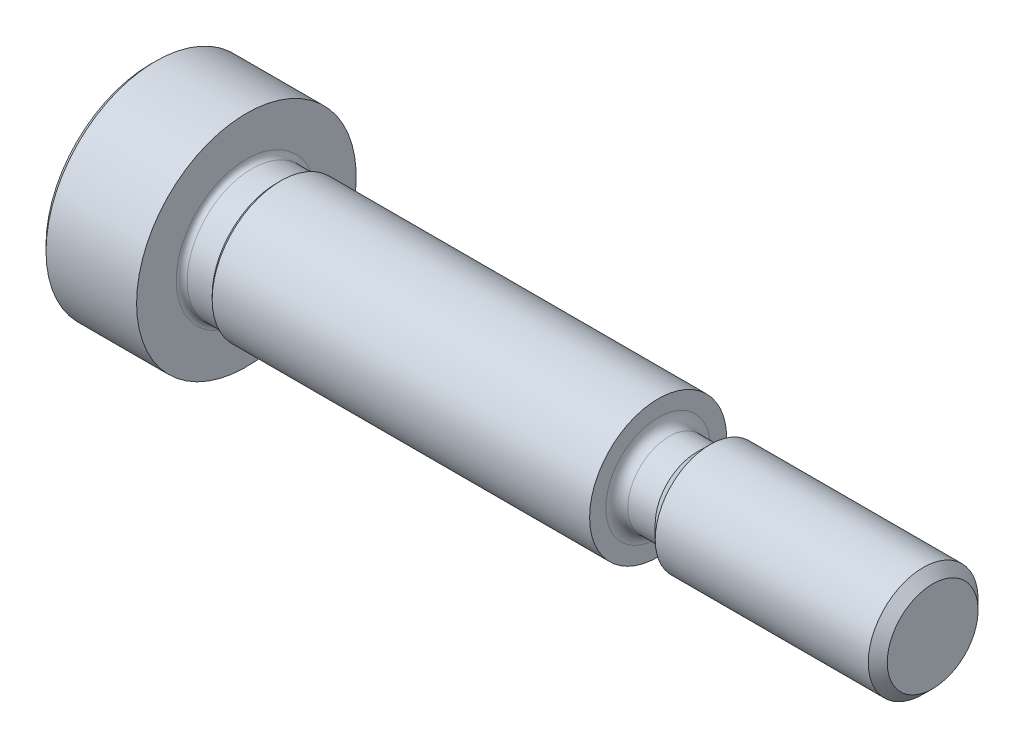
ISO-10303-21;
HEADER;
FILE_DESCRIPTION(('STEP AP214'),'2;1');
FILE_NAME('part.step','',(''),(''),'','','');
FILE_SCHEMA(('AUTOMOTIVE_DESIGN { 1 0 10303 214 1 1 1 1 }'));
ENDSEC;
DATA;
#1=APPLICATION_CONTEXT('core data for automotive mechanical design processes');
#2=APPLICATION_PROTOCOL_DEFINITION('international standard','automotive_design',2000,#1);
#3=PRODUCT_CONTEXT('',#1,'mechanical');
#4=PRODUCT('Part','Part','',(#3));
#5=PRODUCT_RELATED_PRODUCT_CATEGORY('part','',(#4));
#6=PRODUCT_DEFINITION_FORMATION('','',#4);
#7=PRODUCT_DEFINITION_CONTEXT('part definition',#1,'design');
#8=PRODUCT_DEFINITION('design','',#6,#7);
#9=PRODUCT_DEFINITION_SHAPE('','',#8);
#10=(LENGTH_UNIT() NAMED_UNIT(*) SI_UNIT(.MILLI.,.METRE.));
#11=(NAMED_UNIT(*) PLANE_ANGLE_UNIT() SI_UNIT($,.RADIAN.));
#12=(NAMED_UNIT(*) SI_UNIT($,.STERADIAN.) SOLID_ANGLE_UNIT());
#13=UNCERTAINTY_MEASURE_WITH_UNIT(LENGTH_MEASURE(1.E-05),#10,'distance_accuracy_value','');
#14=(GEOMETRIC_REPRESENTATION_CONTEXT(3) GLOBAL_UNCERTAINTY_ASSIGNED_CONTEXT((#13)) GLOBAL_UNIT_ASSIGNED_CONTEXT((#10,
#11,#12)) REPRESENTATION_CONTEXT('',''));
#15=CARTESIAN_POINT('',(0.,0.,0.));
#16=DIRECTION('',(0.,0.,1.));
#17=DIRECTION('',(1.,0.,0.));
#18=AXIS2_PLACEMENT_3D('',#15,#16,#17);
#19=CARTESIAN_POINT('',(0.,0.,0.));
#20=DIRECTION('',(-1.,0.,0.));
#21=DIRECTION('',(0.,0.,1.));
#22=AXIS2_PLACEMENT_3D('',#19,#20,#21);
#23=PLANE('',#22);
#24=CARTESIAN_POINT('',(0.,0.,0.));
#25=DIRECTION('',(-1.,0.,0.));
#26=DIRECTION('',(0.,0.,1.));
#27=AXIS2_PLACEMENT_3D('',#24,#25,#26);
#28=CIRCLE('',#27,7.6);
#29=CARTESIAN_POINT('',(0.,0.,7.6));
#30=VERTEX_POINT('',#29);
#31=EDGE_CURVE('E51',#30,#30,#28,.T.);
#32=ORIENTED_EDGE('',*,*,#31,.T.);
#33=EDGE_LOOP('',(#32));
#34=FACE_BOUND('',#33,.T.);
#35=DIRECTION('',(0.,-0.500000000000001,-0.866025403784438));
#36=VECTOR('',#35,1.);
#37=CARTESIAN_POINT('',(0.,-1.47079981076057,2.5475));
#38=LINE('',#37,#36);
#39=CARTESIAN_POINT('',(0.,-1.47079981076057,2.5475));
#40=VERTEX_POINT('',#39);
#41=CARTESIAN_POINT('',(0.,-2.94159962152114,0.));
#42=VERTEX_POINT('',#41);
#43=EDGE_CURVE('E58',#40,#42,#38,.T.);
#44=ORIENTED_EDGE('',*,*,#43,.T.);
#45=DIRECTION('',(0.,0.500000000000001,-0.866025403784438));
#46=VECTOR('',#45,1.);
#47=CARTESIAN_POINT('',(0.,-2.94159962152114,0.));
#48=LINE('',#47,#46);
#49=CARTESIAN_POINT('',(0.,-1.47079981076057,-2.5475));
#50=VERTEX_POINT('',#49);
#51=EDGE_CURVE('E313',#42,#50,#48,.T.);
#52=ORIENTED_EDGE('',*,*,#51,.T.);
#53=DIRECTION('',(0.,1.,0.));
#54=VECTOR('',#53,1.);
#55=CARTESIAN_POINT('',(0.,-1.47079981076057,-2.5475));
#56=LINE('',#55,#54);
#57=CARTESIAN_POINT('',(0.,1.47079981076057,-2.5475));
#58=VERTEX_POINT('',#57);
#59=EDGE_CURVE('E143',#50,#58,#56,.T.);
#60=ORIENTED_EDGE('',*,*,#59,.T.);
#61=DIRECTION('',(0.,0.500000000000001,0.866025403784438));
#62=VECTOR('',#61,1.);
#63=CARTESIAN_POINT('',(0.,1.47079981076057,-2.5475));
#64=LINE('',#63,#62);
#65=CARTESIAN_POINT('',(0.,2.94159962152114,0.));
#66=VERTEX_POINT('',#65);
#67=EDGE_CURVE('E316',#58,#66,#64,.T.);
#68=ORIENTED_EDGE('',*,*,#67,.T.);
#69=DIRECTION('',(0.,-0.5,0.866025403784438));
#70=VECTOR('',#69,1.);
#71=CARTESIAN_POINT('',(0.,2.94159962152114,0.));
#72=LINE('',#71,#70);
#73=CARTESIAN_POINT('',(0.,1.47079981076057,2.5475));
#74=VERTEX_POINT('',#73);
#75=EDGE_CURVE('E318',#66,#74,#72,.T.);
#76=ORIENTED_EDGE('',*,*,#75,.T.);
#77=DIRECTION('',(0.,-1.,0.));
#78=VECTOR('',#77,1.);
#79=CARTESIAN_POINT('',(0.,1.47079981076057,2.5475));
#80=LINE('',#79,#78);
#81=EDGE_CURVE('E320',#74,#40,#80,.T.);
#82=ORIENTED_EDGE('',*,*,#81,.T.);
#83=EDGE_LOOP('',(#44,#52,#60,#68,#76,#82));
#84=FACE_BOUND('',#83,.T.);
#85=ADVANCED_FACE('F43',(#34,#84),#23,.T.);
#86=CARTESIAN_POINT('',(-6.34999999999999,0.,0.));
#87=DIRECTION('',(-1.,0.,0.));
#88=DIRECTION('',(0.,0.,1.));
#89=AXIS2_PLACEMENT_3D('',#86,#87,#88);
#90=CYLINDRICAL_SURFACE('',#89,8.);
#91=CARTESIAN_POINT('',(0.4,0.,0.));
#92=DIRECTION('',(-1.,0.,0.));
#93=DIRECTION('',(0.,0.,1.));
#94=AXIS2_PLACEMENT_3D('',#91,#92,#93);
#95=CIRCLE('',#94,8.);
#96=CARTESIAN_POINT('',(0.4,0.,8.));
#97=VERTEX_POINT('',#96);
#98=EDGE_CURVE('E11',#97,#97,#95,.F.);
#99=ORIENTED_EDGE('',*,*,#98,.T.);
#100=EDGE_LOOP('',(#99));
#101=FACE_BOUND('',#100,.T.);
#102=CARTESIAN_POINT('',(7.,0.,0.));
#103=DIRECTION('',(-1.,0.,0.));
#104=DIRECTION('',(0.,0.,1.));
#105=AXIS2_PLACEMENT_3D('',#102,#103,#104);
#106=CIRCLE('',#105,8.);
#107=CARTESIAN_POINT('',(7.,0.,8.));
#108=VERTEX_POINT('',#107);
#109=EDGE_CURVE('E190',#108,#108,#106,.T.);
#110=ORIENTED_EDGE('',*,*,#109,.T.);
#111=EDGE_LOOP('',(#110));
#112=FACE_BOUND('',#111,.T.);
#113=ADVANCED_FACE('F210',(#101,#112),#90,.T.);
#114=CARTESIAN_POINT('',(7.,8.,0.));
#115=DIRECTION('',(1.,0.,0.));
#116=DIRECTION('',(0.,0.,-1.));
#117=AXIS2_PLACEMENT_3D('',#114,#115,#116);
#118=PLANE('',#117);
#119=CARTESIAN_POINT('',(7.,0.,0.));
#120=DIRECTION('',(-1.,0.,0.));
#121=DIRECTION('',(0.,0.,1.));
#122=AXIS2_PLACEMENT_3D('',#119,#120,#121);
#123=CIRCLE('',#122,5.11);
#124=CARTESIAN_POINT('',(7.,0.,5.11));
#125=VERTEX_POINT('',#124);
#126=EDGE_CURVE('E187',#125,#125,#123,.T.);
#127=ORIENTED_EDGE('',*,*,#126,.T.);
#128=EDGE_LOOP('',(#127));
#129=FACE_BOUND('',#128,.T.);
#130=ORIENTED_EDGE('',*,*,#109,.F.);
#131=EDGE_LOOP('',(#130));
#132=FACE_BOUND('',#131,.T.);
#133=ADVANCED_FACE('F213',(#129,#132),#118,.T.);
#134=CARTESIAN_POINT('',(7.4,0.,0.));
#135=DIRECTION('',(-1.,0.,0.));
#136=DIRECTION('',(0.,0.,1.));
#137=AXIS2_PLACEMENT_3D('',#134,#135,#136);
#138=TOROIDAL_SURFACE('',#137,5.11,0.4);
#139=ORIENTED_EDGE('',*,*,#126,.F.);
#140=EDGE_LOOP('',(#139));
#141=FACE_BOUND('',#140,.T.);
#142=CARTESIAN_POINT('',(7.4,0.,0.));
#143=DIRECTION('',(-1.,0.,0.));
#144=DIRECTION('',(0.,0.,1.));
#145=AXIS2_PLACEMENT_3D('',#142,#143,#144);
#146=CIRCLE('',#145,4.71);
#147=CARTESIAN_POINT('',(7.4,0.,4.71));
#148=VERTEX_POINT('',#147);
#149=EDGE_CURVE('E184',#148,#148,#146,.T.);
#150=ORIENTED_EDGE('',*,*,#149,.T.);
#151=EDGE_LOOP('',(#150));
#152=FACE_BOUND('',#151,.T.);
#153=ADVANCED_FACE('F219',(#141,#152),#138,.F.);
#154=CARTESIAN_POINT('',(-6.34999999999999,0.,0.));
#155=DIRECTION('',(-1.,0.,0.));
#156=DIRECTION('',(0.,0.,1.));
#157=AXIS2_PLACEMENT_3D('',#154,#155,#156);
#158=CYLINDRICAL_SURFACE('',#157,4.71);
#159=CARTESIAN_POINT('',(9.2165,0.,0.));
#160=DIRECTION('',(-1.,0.,0.));
#161=DIRECTION('',(0.,0.,1.));
#162=AXIS2_PLACEMENT_3D('',#159,#160,#161);
#163=CIRCLE('',#162,4.71);
#164=CARTESIAN_POINT('',(9.2165,0.,4.71));
#165=VERTEX_POINT('',#164);
#166=EDGE_CURVE('E181',#165,#165,#163,.T.);
#167=ORIENTED_EDGE('',*,*,#166,.T.);
#168=EDGE_LOOP('',(#167));
#169=FACE_BOUND('',#168,.T.);
#170=ORIENTED_EDGE('',*,*,#149,.F.);
#171=EDGE_LOOP('',(#170));
#172=FACE_BOUND('',#171,.T.);
#173=ADVANCED_FACE('F223',(#169,#172),#158,.T.);
#174=CARTESIAN_POINT('',(9.2165,0.,0.));
#175=DIRECTION('',(1.,0.,0.));
#176=DIRECTION('',(0.,0.,-1.));
#177=AXIS2_PLACEMENT_3D('',#174,#175,#176);
#178=CONICAL_SURFACE('',#177,4.71,0.785398163397453);
#179=CARTESIAN_POINT('',(9.5,0.,0.));
#180=DIRECTION('',(-1.,0.,0.));
#181=DIRECTION('',(0.,0.,1.));
#182=AXIS2_PLACEMENT_3D('',#179,#180,#181);
#183=CIRCLE('',#182,4.9935);
#184=CARTESIAN_POINT('',(9.5,0.,4.9935));
#185=VERTEX_POINT('',#184);
#186=EDGE_CURVE('E178',#185,#185,#183,.T.);
#187=ORIENTED_EDGE('',*,*,#186,.T.);
#188=EDGE_LOOP('',(#187));
#189=FACE_BOUND('',#188,.T.);
#190=ORIENTED_EDGE('',*,*,#166,.F.);
#191=EDGE_LOOP('',(#190));
#192=FACE_BOUND('',#191,.T.);
#193=ADVANCED_FACE('F227',(#189,#192),#178,.T.);
#194=CARTESIAN_POINT('',(-6.34999999999999,0.,0.));
#195=DIRECTION('',(-1.,0.,0.));
#196=DIRECTION('',(0.,0.,1.));
#197=AXIS2_PLACEMENT_3D('',#194,#195,#196);
#198=CYLINDRICAL_SURFACE('',#197,4.9935);
#199=CARTESIAN_POINT('',(37.,0.,0.));
#200=DIRECTION('',(-1.,0.,0.));
#201=DIRECTION('',(0.,0.,1.));
#202=AXIS2_PLACEMENT_3D('',#199,#200,#201);
#203=CIRCLE('',#202,4.9935);
#204=CARTESIAN_POINT('',(37.,0.,4.9935));
#205=VERTEX_POINT('',#204);
#206=EDGE_CURVE('E175',#205,#205,#203,.T.);
#207=ORIENTED_EDGE('',*,*,#206,.T.);
#208=EDGE_LOOP('',(#207));
#209=FACE_BOUND('',#208,.T.);
#210=ORIENTED_EDGE('',*,*,#186,.F.);
#211=EDGE_LOOP('',(#210));
#212=FACE_BOUND('',#211,.T.);
#213=ADVANCED_FACE('F231',(#209,#212),#198,.T.);
#214=CARTESIAN_POINT('',(37.,4.9935,0.));
#215=DIRECTION('',(1.,0.,0.));
#216=DIRECTION('',(0.,0.,-1.));
#217=AXIS2_PLACEMENT_3D('',#214,#215,#216);
#218=PLANE('',#217);
#219=CARTESIAN_POINT('',(37.,0.,0.));
#220=DIRECTION('',(-1.,0.,0.));
#221=DIRECTION('',(0.,0.,1.));
#222=AXIS2_PLACEMENT_3D('',#219,#220,#221);
#223=CIRCLE('',#222,3.815);
#224=CARTESIAN_POINT('',(37.,0.,3.815));
#225=VERTEX_POINT('',#224);
#226=EDGE_CURVE('E172',#225,#225,#223,.T.);
#227=ORIENTED_EDGE('',*,*,#226,.T.);
#228=EDGE_LOOP('',(#227));
#229=FACE_BOUND('',#228,.T.);
#230=ORIENTED_EDGE('',*,*,#206,.F.);
#231=EDGE_LOOP('',(#230));
#232=FACE_BOUND('',#231,.T.);
#233=ADVANCED_FACE('F235',(#229,#232),#218,.T.);
#234=CARTESIAN_POINT('',(37.8,0.,0.));
#235=DIRECTION('',(-1.,0.,0.));
#236=DIRECTION('',(0.,0.,1.));
#237=AXIS2_PLACEMENT_3D('',#234,#235,#236);
#238=TOROIDAL_SURFACE('',#237,3.815,0.799999999999997);
#239=CARTESIAN_POINT('',(37.8,0.,0.));
#240=DIRECTION('',(-1.,0.,0.));
#241=DIRECTION('',(0.,0.,1.));
#242=AXIS2_PLACEMENT_3D('',#239,#240,#241);
#243=CIRCLE('',#242,3.015);
#244=CARTESIAN_POINT('',(37.8,0.,3.015));
#245=VERTEX_POINT('',#244);
#246=EDGE_CURVE('E169',#245,#245,#243,.T.);
#247=ORIENTED_EDGE('',*,*,#246,.T.);
#248=EDGE_LOOP('',(#247));
#249=FACE_BOUND('',#248,.T.);
#250=ORIENTED_EDGE('',*,*,#226,.F.);
#251=EDGE_LOOP('',(#250));
#252=FACE_BOUND('',#251,.T.);
#253=ADVANCED_FACE('F239',(#249,#252),#238,.F.);
#254=CARTESIAN_POINT('',(-6.34999999999999,0.,0.));
#255=DIRECTION('',(-1.,0.,0.));
#256=DIRECTION('',(0.,0.,1.));
#257=AXIS2_PLACEMENT_3D('',#254,#255,#256);
#258=CYLINDRICAL_SURFACE('',#257,3.015);
#259=CARTESIAN_POINT('',(39.8,0.,0.));
#260=DIRECTION('',(-1.,0.,0.));
#261=DIRECTION('',(0.,0.,1.));
#262=AXIS2_PLACEMENT_3D('',#259,#260,#261);
#263=CIRCLE('',#262,3.015);
#264=CARTESIAN_POINT('',(39.8,0.,3.015));
#265=VERTEX_POINT('',#264);
#266=EDGE_CURVE('E166',#265,#265,#263,.T.);
#267=ORIENTED_EDGE('',*,*,#266,.T.);
#268=EDGE_LOOP('',(#267));
#269=FACE_BOUND('',#268,.T.);
#270=ORIENTED_EDGE('',*,*,#246,.F.);
#271=EDGE_LOOP('',(#270));
#272=FACE_BOUND('',#271,.T.);
#273=ADVANCED_FACE('F243',(#269,#272),#258,.T.);
#274=CARTESIAN_POINT('',(39.8,0.,0.));
#275=DIRECTION('',(1.,0.,0.));
#276=DIRECTION('',(0.,0.,-1.));
#277=AXIS2_PLACEMENT_3D('',#274,#275,#276);
#278=CONICAL_SURFACE('',#277,3.015,0.785398163397448);
#279=CARTESIAN_POINT('',(40.785,0.,0.));
#280=DIRECTION('',(-1.,0.,0.));
#281=DIRECTION('',(0.,0.,1.));
#282=AXIS2_PLACEMENT_3D('',#279,#280,#281);
#283=CIRCLE('',#282,4.);
#284=CARTESIAN_POINT('',(40.785,0.,4.));
#285=VERTEX_POINT('',#284);
#286=EDGE_CURVE('E163',#285,#285,#283,.T.);
#287=ORIENTED_EDGE('',*,*,#286,.T.);
#288=EDGE_LOOP('',(#287));
#289=FACE_BOUND('',#288,.T.);
#290=ORIENTED_EDGE('',*,*,#266,.F.);
#291=EDGE_LOOP('',(#290));
#292=FACE_BOUND('',#291,.T.);
#293=ADVANCED_FACE('F247',(#289,#292),#278,.T.);
#294=CARTESIAN_POINT('',(-6.34999999999999,0.,0.));
#295=DIRECTION('',(-1.,0.,0.));
#296=DIRECTION('',(0.,0.,1.));
#297=AXIS2_PLACEMENT_3D('',#294,#295,#296);
#298=CYLINDRICAL_SURFACE('',#297,4.);
#299=CARTESIAN_POINT('',(56.3095,0.,0.));
#300=DIRECTION('',(-1.,0.,0.));
#301=DIRECTION('',(0.,0.,1.));
#302=AXIS2_PLACEMENT_3D('',#299,#300,#301);
#303=CIRCLE('',#302,4.);
#304=CARTESIAN_POINT('',(56.3095,0.,4.));
#305=VERTEX_POINT('',#304);
#306=EDGE_CURVE('E160',#305,#305,#303,.T.);
#307=ORIENTED_EDGE('',*,*,#306,.T.);
#308=EDGE_LOOP('',(#307));
#309=FACE_BOUND('',#308,.T.);
#310=ORIENTED_EDGE('',*,*,#286,.F.);
#311=EDGE_LOOP('',(#310));
#312=FACE_BOUND('',#311,.T.);
#313=ADVANCED_FACE('F251',(#309,#312),#298,.T.);
#314=CARTESIAN_POINT('',(56.3095,0.,0.));
#315=DIRECTION('',(-1.,0.,0.));
#316=DIRECTION('',(0.,0.,1.));
#317=AXIS2_PLACEMENT_3D('',#314,#315,#316);
#318=CONICAL_SURFACE('',#317,4.,0.785398163397457);
#319=CARTESIAN_POINT('',(57.,0.,0.));
#320=DIRECTION('',(-1.,0.,0.));
#321=DIRECTION('',(0.,0.,1.));
#322=AXIS2_PLACEMENT_3D('',#319,#320,#321);
#323=CIRCLE('',#322,3.30950000000001);
#324=CARTESIAN_POINT('',(57.,0.,3.30950000000001));
#325=VERTEX_POINT('',#324);
#326=EDGE_CURVE('E156',#325,#325,#323,.T.);
#327=ORIENTED_EDGE('',*,*,#326,.T.);
#328=EDGE_LOOP('',(#327));
#329=FACE_BOUND('',#328,.T.);
#330=ORIENTED_EDGE('',*,*,#306,.F.);
#331=EDGE_LOOP('',(#330));
#332=FACE_BOUND('',#331,.T.);
#333=ADVANCED_FACE('F206',(#329,#332),#318,.T.);
#334=CARTESIAN_POINT('',(57.,3.30950000000001,0.));
#335=DIRECTION('',(1.,0.,0.));
#336=DIRECTION('',(0.,0.,-1.));
#337=AXIS2_PLACEMENT_3D('',#334,#335,#336);
#338=PLANE('',#337);
#339=ORIENTED_EDGE('',*,*,#326,.F.);
#340=EDGE_LOOP('',(#339));
#341=FACE_BOUND('',#340,.T.);
#342=ADVANCED_FACE('F197',(#341),#338,.T.);
#343=CARTESIAN_POINT('',(0.,0.,0.));
#344=DIRECTION('',(1.,0.,0.));
#345=DIRECTION('',(0.,0.,-1.));
#346=AXIS2_PLACEMENT_3D('',#343,#344,#345);
#347=CONICAL_SURFACE('',#346,7.6,0.785398163397447);
#348=ORIENTED_EDGE('',*,*,#98,.F.);
#349=EDGE_LOOP('',(#348));
#350=FACE_BOUND('',#349,.T.);
#351=ORIENTED_EDGE('',*,*,#31,.F.);
#352=EDGE_LOOP('',(#351));
#353=FACE_BOUND('',#352,.T.);
#354=ADVANCED_FACE('F45',(#350,#353),#347,.T.);
#355=CARTESIAN_POINT('',(4.2,-2.94159962152114,0.));
#356=DIRECTION('',(0.,0.866025403784438,0.500000000000001));
#357=DIRECTION('',(0.,-0.500000000000001,0.866025403784438));
#358=AXIS2_PLACEMENT_3D('',#355,#356,#357);
#359=PLANE('',#358);
#360=DIRECTION('',(0.,0.500000000000001,-0.866025403784438));
#361=VECTOR('',#360,1.);
#362=CARTESIAN_POINT('',(4.2,-2.94159962152114,0.));
#363=LINE('',#362,#361);
#364=CARTESIAN_POINT('',(4.2,-2.94159962152114,0.));
#365=VERTEX_POINT('',#364);
#366=CARTESIAN_POINT('',(4.2,-2.20619971614086,-1.27375));
#367=VERTEX_POINT('',#366);
#368=EDGE_CURVE('E126',#365,#367,#363,.T.);
#369=ORIENTED_EDGE('',*,*,#368,.T.);
#370=CARTESIAN_POINT('',(4.2,-1.47079981076057,-2.5475));
#371=VERTEX_POINT('',#370);
#372=EDGE_CURVE('E119',#367,#371,#363,.T.);
#373=ORIENTED_EDGE('',*,*,#372,.T.);
#374=DIRECTION('',(-1.,0.,0.));
#375=VECTOR('',#374,1.);
#376=CARTESIAN_POINT('',(4.2,-1.47079981076057,-2.5475));
#377=LINE('',#376,#375);
#378=EDGE_CURVE('E123',#371,#50,#377,.T.);
#379=ORIENTED_EDGE('',*,*,#378,.T.);
#380=ORIENTED_EDGE('',*,*,#51,.F.);
#381=DIRECTION('',(-1.,0.,0.));
#382=VECTOR('',#381,1.);
#383=CARTESIAN_POINT('',(4.2,-2.94159962152114,0.));
#384=LINE('',#383,#382);
#385=EDGE_CURVE('E312',#365,#42,#384,.T.);
#386=ORIENTED_EDGE('',*,*,#385,.F.);
#387=EDGE_LOOP('',(#369,#373,#379,#380,#386));
#388=FACE_BOUND('',#387,.T.);
#389=ADVANCED_FACE('F121',(#388),#359,.T.);
#390=CARTESIAN_POINT('',(4.2,-1.47079981076057,-2.5475));
#391=DIRECTION('',(0.,0.,1.));
#392=DIRECTION('',(0.,-1.,0.));
#393=AXIS2_PLACEMENT_3D('',#390,#391,#392);
#394=PLANE('',#393);
#395=DIRECTION('',(0.,1.,0.));
#396=VECTOR('',#395,1.);
#397=CARTESIAN_POINT('',(4.2,-1.47079981076057,-2.5475));
#398=LINE('',#397,#396);
#399=CARTESIAN_POINT('',(4.2,0.,-2.5475));
#400=VERTEX_POINT('',#399);
#401=EDGE_CURVE('E131',#371,#400,#398,.T.);
#402=ORIENTED_EDGE('',*,*,#401,.T.);
#403=CARTESIAN_POINT('',(4.2,1.47079981076057,-2.5475));
#404=VERTEX_POINT('',#403);
#405=EDGE_CURVE('E138',#400,#404,#398,.T.);
#406=ORIENTED_EDGE('',*,*,#405,.T.);
#407=DIRECTION('',(-1.,0.,0.));
#408=VECTOR('',#407,1.);
#409=CARTESIAN_POINT('',(4.2,1.47079981076057,-2.5475));
#410=LINE('',#409,#408);
#411=EDGE_CURVE('E145',#404,#58,#410,.T.);
#412=ORIENTED_EDGE('',*,*,#411,.T.);
#413=ORIENTED_EDGE('',*,*,#59,.F.);
#414=ORIENTED_EDGE('',*,*,#378,.F.);
#415=EDGE_LOOP('',(#402,#406,#412,#413,#414));
#416=FACE_BOUND('',#415,.T.);
#417=ADVANCED_FACE('F141',(#416),#394,.T.);
#418=CARTESIAN_POINT('',(4.2,1.47079981076057,-2.5475));
#419=DIRECTION('',(0.,-0.866025403784438,0.500000000000001));
#420=DIRECTION('',(0.,-0.500000000000001,-0.866025403784438));
#421=AXIS2_PLACEMENT_3D('',#418,#419,#420);
#422=PLANE('',#421);
#423=DIRECTION('',(0.,0.500000000000001,0.866025403784438));
#424=VECTOR('',#423,1.);
#425=CARTESIAN_POINT('',(4.2,1.47079981076057,-2.5475));
#426=LINE('',#425,#424);
#427=CARTESIAN_POINT('',(4.2,2.20619971614086,-1.27375));
#428=VERTEX_POINT('',#427);
#429=EDGE_CURVE('E340',#404,#428,#426,.T.);
#430=ORIENTED_EDGE('',*,*,#429,.T.);
#431=CARTESIAN_POINT('',(4.2,2.94159962152114,0.));
#432=VERTEX_POINT('',#431);
#433=EDGE_CURVE('E137',#428,#432,#426,.T.);
#434=ORIENTED_EDGE('',*,*,#433,.T.);
#435=DIRECTION('',(-1.,0.,0.));
#436=VECTOR('',#435,1.);
#437=CARTESIAN_POINT('',(4.2,2.94159962152114,0.));
#438=LINE('',#437,#436);
#439=EDGE_CURVE('E151',#432,#66,#438,.T.);
#440=ORIENTED_EDGE('',*,*,#439,.T.);
#441=ORIENTED_EDGE('',*,*,#67,.F.);
#442=ORIENTED_EDGE('',*,*,#411,.F.);
#443=EDGE_LOOP('',(#430,#434,#440,#441,#442));
#444=FACE_BOUND('',#443,.T.);
#445=ADVANCED_FACE('F266',(#444),#422,.T.);
#446=CARTESIAN_POINT('',(4.2,2.94159962152114,0.));
#447=DIRECTION('',(0.,-0.866025403784438,-0.5));
#448=DIRECTION('',(0.,0.5,-0.866025403784438));
#449=AXIS2_PLACEMENT_3D('',#446,#447,#448);
#450=PLANE('',#449);
#451=DIRECTION('',(0.,-0.5,0.866025403784438));
#452=VECTOR('',#451,1.);
#453=CARTESIAN_POINT('',(4.2,2.94159962152114,0.));
#454=LINE('',#453,#452);
#455=CARTESIAN_POINT('',(4.2,2.20619971614086,1.27375));
#456=VERTEX_POINT('',#455);
#457=EDGE_CURVE('E307',#432,#456,#454,.T.);
#458=ORIENTED_EDGE('',*,*,#457,.T.);
#459=CARTESIAN_POINT('',(4.2,1.47079981076057,2.5475));
#460=VERTEX_POINT('',#459);
#461=EDGE_CURVE('E300',#456,#460,#454,.T.);
#462=ORIENTED_EDGE('',*,*,#461,.T.);
#463=DIRECTION('',(-1.,0.,0.));
#464=VECTOR('',#463,1.);
#465=CARTESIAN_POINT('',(4.2,1.47079981076057,2.5475));
#466=LINE('',#465,#464);
#467=EDGE_CURVE('E328',#460,#74,#466,.T.);
#468=ORIENTED_EDGE('',*,*,#467,.T.);
#469=ORIENTED_EDGE('',*,*,#75,.F.);
#470=ORIENTED_EDGE('',*,*,#439,.F.);
#471=EDGE_LOOP('',(#458,#462,#468,#469,#470));
#472=FACE_BOUND('',#471,.T.);
#473=ADVANCED_FACE('F269',(#472),#450,.T.);
#474=CARTESIAN_POINT('',(4.2,1.47079981076057,2.5475));
#475=DIRECTION('',(0.,0.,-1.));
#476=DIRECTION('',(-1.,0.,0.));
#477=AXIS2_PLACEMENT_3D('',#474,#475,#476);
#478=PLANE('',#477);
#479=DIRECTION('',(0.,-1.,0.));
#480=VECTOR('',#479,1.);
#481=CARTESIAN_POINT('',(4.2,1.47079981076057,2.5475));
#482=LINE('',#481,#480);
#483=CARTESIAN_POINT('',(4.2,0.,2.5475));
#484=VERTEX_POINT('',#483);
#485=EDGE_CURVE('E66',#460,#484,#482,.T.);
#486=ORIENTED_EDGE('',*,*,#485,.T.);
#487=CARTESIAN_POINT('',(4.2,-1.47079981076057,2.5475));
#488=VERTEX_POINT('',#487);
#489=EDGE_CURVE('E303',#484,#488,#482,.T.);
#490=ORIENTED_EDGE('',*,*,#489,.T.);
#491=DIRECTION('',(-1.,0.,0.));
#492=VECTOR('',#491,1.);
#493=CARTESIAN_POINT('',(4.2,-1.47079981076057,2.5475));
#494=LINE('',#493,#492);
#495=EDGE_CURVE('E325',#488,#40,#494,.T.);
#496=ORIENTED_EDGE('',*,*,#495,.T.);
#497=ORIENTED_EDGE('',*,*,#81,.F.);
#498=ORIENTED_EDGE('',*,*,#467,.F.);
#499=EDGE_LOOP('',(#486,#490,#496,#497,#498));
#500=FACE_BOUND('',#499,.T.);
#501=ADVANCED_FACE('F273',(#500),#478,.T.);
#502=CARTESIAN_POINT('',(4.2,-1.47079981076057,2.5475));
#503=DIRECTION('',(0.,0.866025403784438,-0.500000000000001));
#504=DIRECTION('',(0.,0.500000000000001,0.866025403784438));
#505=AXIS2_PLACEMENT_3D('',#502,#503,#504);
#506=PLANE('',#505);
#507=DIRECTION('',(0.,-0.500000000000001,-0.866025403784438));
#508=VECTOR('',#507,1.);
#509=CARTESIAN_POINT('',(4.2,-1.47079981076057,2.5475));
#510=LINE('',#509,#508);
#511=CARTESIAN_POINT('',(4.2,-2.20619971614086,1.27375));
#512=VERTEX_POINT('',#511);
#513=EDGE_CURVE('E305',#488,#512,#510,.T.);
#514=ORIENTED_EDGE('',*,*,#513,.T.);
#515=EDGE_CURVE('E302',#512,#365,#510,.T.);
#516=ORIENTED_EDGE('',*,*,#515,.T.);
#517=ORIENTED_EDGE('',*,*,#385,.T.);
#518=ORIENTED_EDGE('',*,*,#43,.F.);
#519=ORIENTED_EDGE('',*,*,#495,.F.);
#520=EDGE_LOOP('',(#514,#516,#517,#518,#519));
#521=FACE_BOUND('',#520,.T.);
#522=ADVANCED_FACE('F277',(#521),#506,.T.);
#523=CARTESIAN_POINT('',(4.2,-2.94159962152114,0.));
#524=DIRECTION('',(-1.,0.,0.));
#525=DIRECTION('',(0.,0.,1.));
#526=AXIS2_PLACEMENT_3D('',#523,#524,#525);
#527=PLANE('',#526);
#528=ORIENTED_EDGE('',*,*,#485,.F.);
#529=ORIENTED_EDGE('',*,*,#461,.F.);
#530=CARTESIAN_POINT('',(4.2,0.,0.));
#531=DIRECTION('',(-1.,0.,0.));
#532=DIRECTION('',(0.,0.,1.));
#533=AXIS2_PLACEMENT_3D('',#530,#531,#532);
#534=CIRCLE('',#533,2.5475);
#535=EDGE_CURVE('E150',#484,#456,#534,.T.);
#536=ORIENTED_EDGE('',*,*,#535,.F.);
#537=EDGE_LOOP('',(#528,#529,#536));
#538=FACE_BOUND('',#537,.T.);
#539=ADVANCED_FACE('F280',(#538),#527,.T.);
#540=ORIENTED_EDGE('',*,*,#457,.F.);
#541=ORIENTED_EDGE('',*,*,#433,.F.);
#542=EDGE_CURVE('E157',#456,#428,#534,.T.);
#543=ORIENTED_EDGE('',*,*,#542,.F.);
#544=EDGE_LOOP('',(#540,#541,#543));
#545=FACE_BOUND('',#544,.T.);
#546=ADVANCED_FACE('F291',(#545),#527,.T.);
#547=ORIENTED_EDGE('',*,*,#429,.F.);
#548=ORIENTED_EDGE('',*,*,#405,.F.);
#549=EDGE_CURVE('E343',#428,#400,#534,.T.);
#550=ORIENTED_EDGE('',*,*,#549,.F.);
#551=EDGE_LOOP('',(#547,#548,#550));
#552=FACE_BOUND('',#551,.T.);
#553=ADVANCED_FACE('F296',(#552),#527,.T.);
#554=ORIENTED_EDGE('',*,*,#401,.F.);
#555=ORIENTED_EDGE('',*,*,#372,.F.);
#556=EDGE_CURVE('E133',#400,#367,#534,.T.);
#557=ORIENTED_EDGE('',*,*,#556,.F.);
#558=EDGE_LOOP('',(#554,#555,#557));
#559=FACE_BOUND('',#558,.T.);
#560=ADVANCED_FACE('F132',(#559),#527,.T.);
#561=ORIENTED_EDGE('',*,*,#368,.F.);
#562=ORIENTED_EDGE('',*,*,#515,.F.);
#563=EDGE_CURVE('E148',#367,#512,#534,.T.);
#564=ORIENTED_EDGE('',*,*,#563,.F.);
#565=EDGE_LOOP('',(#561,#562,#564));
#566=FACE_BOUND('',#565,.T.);
#567=ADVANCED_FACE('F283',(#566),#527,.T.);
#568=ORIENTED_EDGE('',*,*,#513,.F.);
#569=ORIENTED_EDGE('',*,*,#489,.F.);
#570=EDGE_CURVE('E144',#512,#484,#534,.T.);
#571=ORIENTED_EDGE('',*,*,#570,.F.);
#572=EDGE_LOOP('',(#568,#569,#571));
#573=FACE_BOUND('',#572,.T.);
#574=ADVANCED_FACE('F261',(#573),#527,.T.);
#575=CARTESIAN_POINT('',(5.67079981076059,0.,0.));
#576=DIRECTION('',(-1.,0.,0.));
#577=DIRECTION('',(0.,0.,1.));
#578=AXIS2_PLACEMENT_3D('',#575,#576,#577);
#579=CONICAL_SURFACE('',#578,0.,1.04719755119659);
#580=ORIENTED_EDGE('',*,*,#535,.T.);
#581=ORIENTED_EDGE('',*,*,#542,.T.);
#582=ORIENTED_EDGE('',*,*,#549,.T.);
#583=ORIENTED_EDGE('',*,*,#556,.T.);
#584=ORIENTED_EDGE('',*,*,#563,.T.);
#585=ORIENTED_EDGE('',*,*,#570,.T.);
#586=EDGE_LOOP('',(#580,#581,#582,#583,#584,#585));
#587=FACE_BOUND('',#586,.T.);
#588=CARTESIAN_POINT('',(5.67079981076059,0.,0.));
#589=VERTEX_POINT('',#588);
#590=VERTEX_LOOP('',#589);
#591=FACE_BOUND('',#590,.T.);
#592=ADVANCED_FACE('F259',(#587,#591),#579,.F.);
#593=CLOSED_SHELL('',(#85,#113,#133,#153,#173,#193,#213,#233,#253,#273,#293,#313,#333,#342,#354,
#389,#417,#445,#473,#501,#522,#539,#546,#553,#560,#567,#574,#592));
#594=MANIFOLD_SOLID_BREP('B2',#593);
#595=ADVANCED_BREP_SHAPE_REPRESENTATION('',(#18,#594),#14);
#596=SHAPE_DEFINITION_REPRESENTATION(#9,#595);
ENDSEC;
END-ISO-10303-21;
